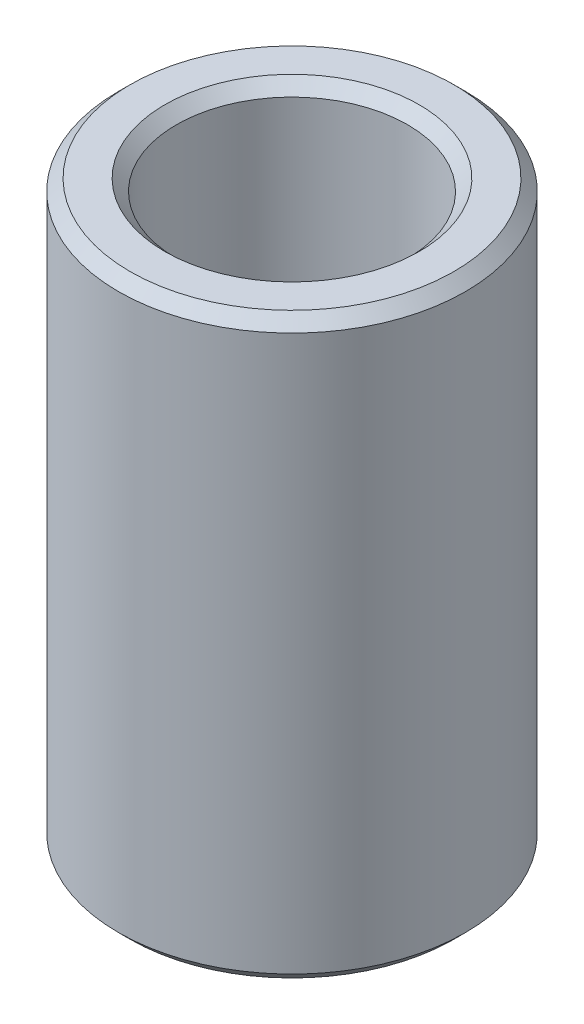
ISO-10303-21;
HEADER;
FILE_DESCRIPTION(('STEP AP214'),'2;1');
FILE_NAME('part.step','',(''),(''),'','','');
FILE_SCHEMA(('AUTOMOTIVE_DESIGN { 1 0 10303 214 1 1 1 1 }'));
ENDSEC;
DATA;
#1=APPLICATION_CONTEXT('core data for automotive mechanical design processes');
#2=APPLICATION_PROTOCOL_DEFINITION('international standard','automotive_design',2000,#1);
#3=PRODUCT_CONTEXT('',#1,'mechanical');
#4=PRODUCT('Part','Part','',(#3));
#5=PRODUCT_RELATED_PRODUCT_CATEGORY('part','',(#4));
#6=PRODUCT_DEFINITION_FORMATION('','',#4);
#7=PRODUCT_DEFINITION_CONTEXT('part definition',#1,'design');
#8=PRODUCT_DEFINITION('design','',#6,#7);
#9=PRODUCT_DEFINITION_SHAPE('','',#8);
#10=(LENGTH_UNIT() NAMED_UNIT(*) SI_UNIT(.MILLI.,.METRE.));
#11=(NAMED_UNIT(*) PLANE_ANGLE_UNIT() SI_UNIT($,.RADIAN.));
#12=(NAMED_UNIT(*) SI_UNIT($,.STERADIAN.) SOLID_ANGLE_UNIT());
#13=UNCERTAINTY_MEASURE_WITH_UNIT(LENGTH_MEASURE(1.E-05),#10,'distance_accuracy_value','');
#14=(GEOMETRIC_REPRESENTATION_CONTEXT(3) GLOBAL_UNCERTAINTY_ASSIGNED_CONTEXT((#13)) GLOBAL_UNIT_ASSIGNED_CONTEXT((#10,
#11,#12)) REPRESENTATION_CONTEXT('',''));
#15=CARTESIAN_POINT('',(0.,0.,0.));
#16=DIRECTION('',(0.,0.,1.));
#17=DIRECTION('',(1.,0.,0.));
#18=AXIS2_PLACEMENT_3D('',#15,#16,#17);
#19=CARTESIAN_POINT('',(0.,10.,0.));
#20=DIRECTION('',(0.,1.,0.));
#21=DIRECTION('',(0.,0.,1.));
#22=AXIS2_PLACEMENT_3D('',#19,#20,#21);
#23=PLANE('',#22);
#24=CARTESIAN_POINT('',(0.,10.,0.));
#25=DIRECTION('',(0.,1.,0.));
#26=DIRECTION('',(0.,0.,1.));
#27=AXIS2_PLACEMENT_3D('',#24,#25,#26);
#28=CIRCLE('',#27,2.2);
#29=CARTESIAN_POINT('',(0.,10.,2.2));
#30=VERTEX_POINT('',#29);
#31=EDGE_CURVE('E10',#30,#30,#28,.F.);
#32=ORIENTED_EDGE('',*,*,#31,.T.);
#33=EDGE_LOOP('',(#32));
#34=FACE_BOUND('',#33,.T.);
#35=CARTESIAN_POINT('',(0.,10.,0.));
#36=DIRECTION('',(0.,1.,0.));
#37=DIRECTION('',(0.,0.,1.));
#38=AXIS2_PLACEMENT_3D('',#35,#36,#37);
#39=CIRCLE('',#38,2.8);
#40=CARTESIAN_POINT('',(0.,10.,2.8));
#41=VERTEX_POINT('',#40);
#42=EDGE_CURVE('E54',#41,#41,#39,.T.);
#43=ORIENTED_EDGE('',*,*,#42,.T.);
#44=EDGE_LOOP('',(#43));
#45=FACE_BOUND('',#44,.T.);
#46=ADVANCED_FACE('F45',(#34,#45),#23,.T.);
#47=CARTESIAN_POINT('',(0.,0.,0.));
#48=DIRECTION('',(0.,1.,0.));
#49=DIRECTION('',(0.,0.,1.));
#50=AXIS2_PLACEMENT_3D('',#47,#48,#49);
#51=PLANE('',#50);
#52=CARTESIAN_POINT('',(0.,0.,0.));
#53=DIRECTION('',(0.,1.,0.));
#54=DIRECTION('',(0.,0.,1.));
#55=AXIS2_PLACEMENT_3D('',#52,#53,#54);
#56=CIRCLE('',#55,2.8);
#57=CARTESIAN_POINT('',(0.,0.,2.8));
#58=VERTEX_POINT('',#57);
#59=EDGE_CURVE('E64',#58,#58,#56,.F.);
#60=ORIENTED_EDGE('',*,*,#59,.T.);
#61=EDGE_LOOP('',(#60));
#62=FACE_BOUND('',#61,.T.);
#63=CARTESIAN_POINT('',(0.,0.,0.));
#64=DIRECTION('',(0.,1.,0.));
#65=DIRECTION('',(0.,0.,1.));
#66=AXIS2_PLACEMENT_3D('',#63,#64,#65);
#67=CIRCLE('',#66,2.);
#68=CARTESIAN_POINT('',(0.,0.,2.));
#69=VERTEX_POINT('',#68);
#70=EDGE_CURVE('E78',#69,#69,#67,.T.);
#71=ORIENTED_EDGE('',*,*,#70,.T.);
#72=EDGE_LOOP('',(#71));
#73=FACE_BOUND('',#72,.T.);
#74=ADVANCED_FACE('F83',(#62,#73),#51,.F.);
#75=CARTESIAN_POINT('',(0.,10.,0.));
#76=DIRECTION('',(0.,-1.,0.));
#77=DIRECTION('',(0.,0.,-1.));
#78=AXIS2_PLACEMENT_3D('',#75,#76,#77);
#79=CYLINDRICAL_SURFACE('',#78,3.);
#80=CARTESIAN_POINT('',(0.,0.199999999999997,0.));
#81=DIRECTION('',(0.,1.,0.));
#82=DIRECTION('',(0.,0.,1.));
#83=AXIS2_PLACEMENT_3D('',#80,#81,#82);
#84=CIRCLE('',#83,3.);
#85=CARTESIAN_POINT('',(0.,0.199999999999997,3.));
#86=VERTEX_POINT('',#85);
#87=EDGE_CURVE('E70',#86,#86,#84,.T.);
#88=ORIENTED_EDGE('',*,*,#87,.T.);
#89=EDGE_LOOP('',(#88));
#90=FACE_BOUND('',#89,.T.);
#91=CARTESIAN_POINT('',(0.,9.8,0.));
#92=DIRECTION('',(0.,1.,0.));
#93=DIRECTION('',(0.,0.,1.));
#94=AXIS2_PLACEMENT_3D('',#91,#92,#93);
#95=CIRCLE('',#94,3.);
#96=CARTESIAN_POINT('',(0.,9.8,3.));
#97=VERTEX_POINT('',#96);
#98=EDGE_CURVE('E74',#97,#97,#95,.F.);
#99=ORIENTED_EDGE('',*,*,#98,.T.);
#100=EDGE_LOOP('',(#99));
#101=FACE_BOUND('',#100,.T.);
#102=ADVANCED_FACE('F88',(#90,#101),#79,.T.);
#103=CARTESIAN_POINT('',(0.,10.,0.));
#104=DIRECTION('',(0.,-1.,0.));
#105=DIRECTION('',(0.,0.,-1.));
#106=AXIS2_PLACEMENT_3D('',#103,#104,#105);
#107=CYLINDRICAL_SURFACE('',#106,2.);
#108=CARTESIAN_POINT('',(0.,9.8,0.));
#109=DIRECTION('',(0.,1.,0.));
#110=DIRECTION('',(0.,0.,1.));
#111=AXIS2_PLACEMENT_3D('',#108,#109,#110);
#112=CIRCLE('',#111,2.);
#113=CARTESIAN_POINT('',(0.,9.8,2.));
#114=VERTEX_POINT('',#113);
#115=EDGE_CURVE('E59',#114,#114,#112,.T.);
#116=ORIENTED_EDGE('',*,*,#115,.T.);
#117=EDGE_LOOP('',(#116));
#118=FACE_BOUND('',#117,.T.);
#119=ORIENTED_EDGE('',*,*,#70,.F.);
#120=EDGE_LOOP('',(#119));
#121=FACE_BOUND('',#120,.T.);
#122=ADVANCED_FACE('F85',(#118,#121),#107,.F.);
#123=CARTESIAN_POINT('',(0.,0.199999999999997,0.));
#124=DIRECTION('',(0.,1.,0.));
#125=DIRECTION('',(0.,0.,1.));
#126=AXIS2_PLACEMENT_3D('',#123,#124,#125);
#127=CONICAL_SURFACE('',#126,3.,0.785398163397448);
#128=ORIENTED_EDGE('',*,*,#59,.F.);
#129=EDGE_LOOP('',(#128));
#130=FACE_BOUND('',#129,.T.);
#131=ORIENTED_EDGE('',*,*,#87,.F.);
#132=EDGE_LOOP('',(#131));
#133=FACE_BOUND('',#132,.T.);
#134=ADVANCED_FACE('F87',(#130,#133),#127,.T.);
#135=CARTESIAN_POINT('',(0.,9.8,0.));
#136=DIRECTION('',(0.,1.,0.));
#137=DIRECTION('',(0.,0.,1.));
#138=AXIS2_PLACEMENT_3D('',#135,#136,#137);
#139=CONICAL_SURFACE('',#138,2.,0.785398163397444);
#140=ORIENTED_EDGE('',*,*,#31,.F.);
#141=EDGE_LOOP('',(#140));
#142=FACE_BOUND('',#141,.T.);
#143=ORIENTED_EDGE('',*,*,#115,.F.);
#144=EDGE_LOOP('',(#143));
#145=FACE_BOUND('',#144,.T.);
#146=ADVANCED_FACE('F95',(#142,#145),#139,.F.);
#147=CARTESIAN_POINT('',(0.,10.,0.));
#148=DIRECTION('',(0.,-1.,0.));
#149=DIRECTION('',(0.,0.,-1.));
#150=AXIS2_PLACEMENT_3D('',#147,#148,#149);
#151=CONICAL_SURFACE('',#150,2.8,0.785398163397444);
#152=ORIENTED_EDGE('',*,*,#98,.F.);
#153=EDGE_LOOP('',(#152));
#154=FACE_BOUND('',#153,.T.);
#155=ORIENTED_EDGE('',*,*,#42,.F.);
#156=EDGE_LOOP('',(#155));
#157=FACE_BOUND('',#156,.T.);
#158=ADVANCED_FACE('F48',(#154,#157),#151,.T.);
#159=CLOSED_SHELL('',(#46,#74,#102,#122,#134,#146,#158));
#160=MANIFOLD_SOLID_BREP('B2',#159);
#161=ADVANCED_BREP_SHAPE_REPRESENTATION('',(#18,#160),#14);
#162=SHAPE_DEFINITION_REPRESENTATION(#9,#161);
ENDSEC;
END-ISO-10303-21;
